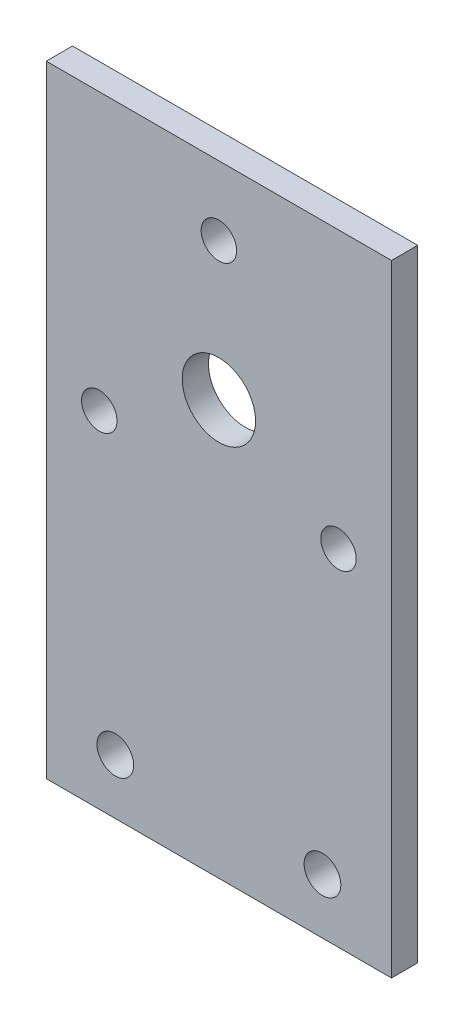
ISO-10303-21;
HEADER;
FILE_DESCRIPTION(('STEP AP214'),'2;1');
FILE_NAME('part.step','',(''),(''),'','','');
FILE_SCHEMA(('AUTOMOTIVE_DESIGN { 1 0 10303 214 1 1 1 1 }'));
ENDSEC;
DATA;
#1=APPLICATION_CONTEXT('core data for automotive mechanical design processes');
#2=APPLICATION_PROTOCOL_DEFINITION('international standard','automotive_design',2000,#1);
#3=PRODUCT_CONTEXT('',#1,'mechanical');
#4=PRODUCT('Part','Part','',(#3));
#5=PRODUCT_RELATED_PRODUCT_CATEGORY('part','',(#4));
#6=PRODUCT_DEFINITION_FORMATION('','',#4);
#7=PRODUCT_DEFINITION_CONTEXT('part definition',#1,'design');
#8=PRODUCT_DEFINITION('design','',#6,#7);
#9=PRODUCT_DEFINITION_SHAPE('','',#8);
#10=(LENGTH_UNIT() NAMED_UNIT(*) SI_UNIT(.MILLI.,.METRE.));
#11=(NAMED_UNIT(*) PLANE_ANGLE_UNIT() SI_UNIT($,.RADIAN.));
#12=(NAMED_UNIT(*) SI_UNIT($,.STERADIAN.) SOLID_ANGLE_UNIT());
#13=UNCERTAINTY_MEASURE_WITH_UNIT(LENGTH_MEASURE(1.E-05),#10,'distance_accuracy_value','');
#14=(GEOMETRIC_REPRESENTATION_CONTEXT(3) GLOBAL_UNCERTAINTY_ASSIGNED_CONTEXT((#13)) GLOBAL_UNIT_ASSIGNED_CONTEXT((#10,
#11,#12)) REPRESENTATION_CONTEXT('',''));
#15=CARTESIAN_POINT('',(0.,0.,0.));
#16=DIRECTION('',(0.,0.,1.));
#17=DIRECTION('',(1.,0.,0.));
#18=AXIS2_PLACEMENT_3D('',#15,#16,#17);
#19=CARTESIAN_POINT('',(0.,0.,-4.826));
#20=DIRECTION('',(-1.,0.,0.));
#21=DIRECTION('',(0.,0.,1.));
#22=AXIS2_PLACEMENT_3D('',#19,#20,#21);
#23=PLANE('',#22);
#24=DIRECTION('',(0.,-1.,0.));
#25=VECTOR('',#24,1.);
#26=CARTESIAN_POINT('',(0.,0.,0.));
#27=LINE('',#26,#25);
#28=CARTESIAN_POINT('',(0.,114.3,0.));
#29=VERTEX_POINT('',#28);
#30=CARTESIAN_POINT('',(0.,0.,0.));
#31=VERTEX_POINT('',#30);
#32=EDGE_CURVE('E106',#29,#31,#27,.T.);
#33=ORIENTED_EDGE('',*,*,#32,.F.);
#34=DIRECTION('',(0.,0.,1.));
#35=VECTOR('',#34,1.);
#36=CARTESIAN_POINT('',(0.,114.3,-4.826));
#37=LINE('',#36,#35);
#38=CARTESIAN_POINT('',(0.,114.3,-4.826));
#39=VERTEX_POINT('',#38);
#40=EDGE_CURVE('E11',#39,#29,#37,.T.);
#41=ORIENTED_EDGE('',*,*,#40,.F.);
#42=DIRECTION('',(0.,-1.,0.));
#43=VECTOR('',#42,1.);
#44=CARTESIAN_POINT('',(0.,0.,-4.826));
#45=LINE('',#44,#43);
#46=CARTESIAN_POINT('',(0.,0.,-4.826));
#47=VERTEX_POINT('',#46);
#48=EDGE_CURVE('E99',#39,#47,#45,.T.);
#49=ORIENTED_EDGE('',*,*,#48,.T.);
#50=DIRECTION('',(0.,0.,1.));
#51=VECTOR('',#50,1.);
#52=CARTESIAN_POINT('',(0.,0.,-4.826));
#53=LINE('',#52,#51);
#54=EDGE_CURVE('E44',#47,#31,#53,.T.);
#55=ORIENTED_EDGE('',*,*,#54,.T.);
#56=EDGE_LOOP('',(#33,#41,#49,#55));
#57=FACE_BOUND('',#56,.T.);
#58=ADVANCED_FACE('F41',(#57),#23,.T.);
#59=CARTESIAN_POINT('',(0.,114.3,-4.826));
#60=DIRECTION('',(0.,1.,0.));
#61=DIRECTION('',(0.,0.,1.));
#62=AXIS2_PLACEMENT_3D('',#59,#60,#61);
#63=PLANE('',#62);
#64=DIRECTION('',(-1.,0.,0.));
#65=VECTOR('',#64,1.);
#66=CARTESIAN_POINT('',(0.,114.3,0.));
#67=LINE('',#66,#65);
#68=CARTESIAN_POINT('',(63.5000000000001,114.3,0.));
#69=VERTEX_POINT('',#68);
#70=EDGE_CURVE('E101',#69,#29,#67,.T.);
#71=ORIENTED_EDGE('',*,*,#70,.F.);
#72=DIRECTION('',(0.,0.,1.));
#73=VECTOR('',#72,1.);
#74=CARTESIAN_POINT('',(63.5000000000001,114.3,-4.826));
#75=LINE('',#74,#73);
#76=CARTESIAN_POINT('',(63.5000000000001,114.3,-4.826));
#77=VERTEX_POINT('',#76);
#78=EDGE_CURVE('E50',#77,#69,#75,.T.);
#79=ORIENTED_EDGE('',*,*,#78,.F.);
#80=DIRECTION('',(-1.,0.,0.));
#81=VECTOR('',#80,1.);
#82=CARTESIAN_POINT('',(0.,114.3,-4.826));
#83=LINE('',#82,#81);
#84=EDGE_CURVE('E96',#77,#39,#83,.T.);
#85=ORIENTED_EDGE('',*,*,#84,.T.);
#86=ORIENTED_EDGE('',*,*,#40,.T.);
#87=EDGE_LOOP('',(#71,#79,#85,#86));
#88=FACE_BOUND('',#87,.T.);
#89=ADVANCED_FACE('F117',(#88),#63,.T.);
#90=CARTESIAN_POINT('',(63.5000000000002,0.,-4.826));
#91=DIRECTION('',(1.,0.,0.));
#92=DIRECTION('',(0.,0.,-1.));
#93=AXIS2_PLACEMENT_3D('',#90,#91,#92);
#94=PLANE('',#93);
#95=DIRECTION('',(0.,1.,0.));
#96=VECTOR('',#95,1.);
#97=CARTESIAN_POINT('',(63.5000000000002,0.,0.));
#98=LINE('',#97,#96);
#99=CARTESIAN_POINT('',(63.5000000000002,0.,0.));
#100=VERTEX_POINT('',#99);
#101=EDGE_CURVE('E91',#100,#69,#98,.T.);
#102=ORIENTED_EDGE('',*,*,#101,.F.);
#103=DIRECTION('',(0.,0.,1.));
#104=VECTOR('',#103,1.);
#105=CARTESIAN_POINT('',(63.5000000000002,0.,-4.826));
#106=LINE('',#105,#104);
#107=CARTESIAN_POINT('',(63.5000000000002,0.,-4.826));
#108=VERTEX_POINT('',#107);
#109=EDGE_CURVE('E86',#108,#100,#106,.T.);
#110=ORIENTED_EDGE('',*,*,#109,.F.);
#111=DIRECTION('',(0.,1.,0.));
#112=VECTOR('',#111,1.);
#113=CARTESIAN_POINT('',(63.5000000000002,0.,-4.826));
#114=LINE('',#113,#112);
#115=EDGE_CURVE('E89',#108,#77,#114,.T.);
#116=ORIENTED_EDGE('',*,*,#115,.T.);
#117=ORIENTED_EDGE('',*,*,#78,.T.);
#118=EDGE_LOOP('',(#102,#110,#116,#117));
#119=FACE_BOUND('',#118,.T.);
#120=ADVANCED_FACE('F88',(#119),#94,.T.);
#121=CARTESIAN_POINT('',(0.,0.,-4.826));
#122=DIRECTION('',(0.,-1.,0.));
#123=DIRECTION('',(0.,0.,-1.));
#124=AXIS2_PLACEMENT_3D('',#121,#122,#123);
#125=PLANE('',#124);
#126=DIRECTION('',(1.,0.,0.));
#127=VECTOR('',#126,1.);
#128=CARTESIAN_POINT('',(0.,0.,0.));
#129=LINE('',#128,#127);
#130=EDGE_CURVE('E109',#31,#100,#129,.T.);
#131=ORIENTED_EDGE('',*,*,#130,.F.);
#132=ORIENTED_EDGE('',*,*,#54,.F.);
#133=DIRECTION('',(1.,0.,0.));
#134=VECTOR('',#133,1.);
#135=CARTESIAN_POINT('',(0.,0.,-4.826));
#136=LINE('',#135,#134);
#137=EDGE_CURVE('E95',#47,#108,#136,.T.);
#138=ORIENTED_EDGE('',*,*,#137,.T.);
#139=ORIENTED_EDGE('',*,*,#109,.T.);
#140=EDGE_LOOP('',(#131,#132,#138,#139));
#141=FACE_BOUND('',#140,.T.);
#142=ADVANCED_FACE('F98',(#141),#125,.T.);
#143=CARTESIAN_POINT('',(0.,0.,-4.826));
#144=DIRECTION('',(0.,0.,-1.));
#145=DIRECTION('',(-1.,0.,0.));
#146=AXIS2_PLACEMENT_3D('',#143,#144,#145);
#147=PLANE('',#146);
#148=CARTESIAN_POINT('',(31.7500000000001,76.2000000000002,-4.826));
#149=DIRECTION('',(0.,0.,1.));
#150=DIRECTION('',(1.,0.,0.));
#151=AXIS2_PLACEMENT_3D('',#148,#149,#150);
#152=CIRCLE('',#151,6.746875);
#153=CARTESIAN_POINT('',(38.4968750000001,76.2000000000002,-4.826));
#154=VERTEX_POINT('',#153);
#155=EDGE_CURVE('E166',#154,#154,#152,.T.);
#156=ORIENTED_EDGE('',*,*,#155,.T.);
#157=EDGE_LOOP('',(#156));
#158=FACE_BOUND('',#157,.T.);
#159=CARTESIAN_POINT('',(31.7500000000001,101.6,-4.826));
#160=DIRECTION('',(0.,0.,1.));
#161=DIRECTION('',(1.,0.,0.));
#162=AXIS2_PLACEMENT_3D('',#159,#160,#161);
#163=CIRCLE('',#162,3.2639);
#164=CARTESIAN_POINT('',(35.0139000000001,101.6,-4.826));
#165=VERTEX_POINT('',#164);
#166=EDGE_CURVE('E176',#165,#165,#163,.T.);
#167=ORIENTED_EDGE('',*,*,#166,.T.);
#168=EDGE_LOOP('',(#167));
#169=FACE_BOUND('',#168,.T.);
#170=CARTESIAN_POINT('',(9.7536,63.5000000000002,-4.826));
#171=DIRECTION('',(0.,0.,1.));
#172=DIRECTION('',(1.,0.,0.));
#173=AXIS2_PLACEMENT_3D('',#170,#171,#172);
#174=CIRCLE('',#173,3.2639);
#175=CARTESIAN_POINT('',(13.0175,63.5000000000002,-4.826));
#176=VERTEX_POINT('',#175);
#177=EDGE_CURVE('E182',#176,#176,#174,.T.);
#178=ORIENTED_EDGE('',*,*,#177,.T.);
#179=EDGE_LOOP('',(#178));
#180=FACE_BOUND('',#179,.T.);
#181=CARTESIAN_POINT('',(53.7464000000002,63.5000000000002,-4.826));
#182=DIRECTION('',(0.,0.,1.));
#183=DIRECTION('',(1.,0.,0.));
#184=AXIS2_PLACEMENT_3D('',#181,#182,#183);
#185=CIRCLE('',#184,3.2639);
#186=CARTESIAN_POINT('',(57.0103000000002,63.5000000000002,-4.826));
#187=VERTEX_POINT('',#186);
#188=EDGE_CURVE('E188',#187,#187,#185,.T.);
#189=ORIENTED_EDGE('',*,*,#188,.T.);
#190=EDGE_LOOP('',(#189));
#191=FACE_BOUND('',#190,.T.);
#192=CARTESIAN_POINT('',(12.7000000000001,10.16,-4.826));
#193=DIRECTION('',(0.,0.,1.));
#194=DIRECTION('',(1.,0.,0.));
#195=AXIS2_PLACEMENT_3D('',#192,#193,#194);
#196=CIRCLE('',#195,3.3782);
#197=CARTESIAN_POINT('',(16.0782000000001,10.16,-4.826));
#198=VERTEX_POINT('',#197);
#199=EDGE_CURVE('E194',#198,#198,#196,.T.);
#200=ORIENTED_EDGE('',*,*,#199,.T.);
#201=EDGE_LOOP('',(#200));
#202=FACE_BOUND('',#201,.T.);
#203=CARTESIAN_POINT('',(50.8000000000002,10.16,-4.826));
#204=DIRECTION('',(0.,0.,1.));
#205=DIRECTION('',(1.,0.,0.));
#206=AXIS2_PLACEMENT_3D('',#203,#204,#205);
#207=CIRCLE('',#206,3.3782);
#208=CARTESIAN_POINT('',(54.1782000000002,10.16,-4.826));
#209=VERTEX_POINT('',#208);
#210=EDGE_CURVE('E110',#209,#209,#207,.T.);
#211=ORIENTED_EDGE('',*,*,#210,.T.);
#212=EDGE_LOOP('',(#211));
#213=FACE_BOUND('',#212,.T.);
#214=ORIENTED_EDGE('',*,*,#48,.F.);
#215=ORIENTED_EDGE('',*,*,#84,.F.);
#216=ORIENTED_EDGE('',*,*,#115,.F.);
#217=ORIENTED_EDGE('',*,*,#137,.F.);
#218=EDGE_LOOP('',(#214,#215,#216,#217));
#219=FACE_BOUND('',#218,.T.);
#220=ADVANCED_FACE('F94',(#158,#169,#180,#191,#202,#213,#219),#147,.T.);
#221=CARTESIAN_POINT('',(0.,0.,0.));
#222=DIRECTION('',(0.,0.,-1.));
#223=DIRECTION('',(-1.,0.,0.));
#224=AXIS2_PLACEMENT_3D('',#221,#222,#223);
#225=PLANE('',#224);
#226=CARTESIAN_POINT('',(31.7500000000001,76.2000000000002,0.));
#227=DIRECTION('',(0.,0.,1.));
#228=DIRECTION('',(1.,0.,0.));
#229=AXIS2_PLACEMENT_3D('',#226,#227,#228);
#230=CIRCLE('',#229,6.746875);
#231=CARTESIAN_POINT('',(38.4968750000001,76.2000000000002,0.));
#232=VERTEX_POINT('',#231);
#233=EDGE_CURVE('E169',#232,#232,#230,.T.);
#234=ORIENTED_EDGE('',*,*,#233,.F.);
#235=EDGE_LOOP('',(#234));
#236=FACE_BOUND('',#235,.T.);
#237=CARTESIAN_POINT('',(31.7500000000001,101.6,0.));
#238=DIRECTION('',(0.,0.,1.));
#239=DIRECTION('',(1.,0.,0.));
#240=AXIS2_PLACEMENT_3D('',#237,#238,#239);
#241=CIRCLE('',#240,3.26389999999999);
#242=CARTESIAN_POINT('',(35.0139000000001,101.6,0.));
#243=VERTEX_POINT('',#242);
#244=EDGE_CURVE('E171',#243,#243,#241,.T.);
#245=ORIENTED_EDGE('',*,*,#244,.F.);
#246=EDGE_LOOP('',(#245));
#247=FACE_BOUND('',#246,.T.);
#248=CARTESIAN_POINT('',(9.7536,63.5000000000002,0.));
#249=DIRECTION('',(0.,0.,1.));
#250=DIRECTION('',(1.,0.,0.));
#251=AXIS2_PLACEMENT_3D('',#248,#249,#250);
#252=CIRCLE('',#251,3.26389999999999);
#253=CARTESIAN_POINT('',(13.0175,63.5000000000002,0.));
#254=VERTEX_POINT('',#253);
#255=EDGE_CURVE('E179',#254,#254,#252,.T.);
#256=ORIENTED_EDGE('',*,*,#255,.F.);
#257=EDGE_LOOP('',(#256));
#258=FACE_BOUND('',#257,.T.);
#259=CARTESIAN_POINT('',(53.7464000000002,63.5000000000002,0.));
#260=DIRECTION('',(0.,0.,1.));
#261=DIRECTION('',(1.,0.,0.));
#262=AXIS2_PLACEMENT_3D('',#259,#260,#261);
#263=CIRCLE('',#262,3.26389999999999);
#264=CARTESIAN_POINT('',(57.0103000000002,63.5000000000002,0.));
#265=VERTEX_POINT('',#264);
#266=EDGE_CURVE('E185',#265,#265,#263,.T.);
#267=ORIENTED_EDGE('',*,*,#266,.F.);
#268=EDGE_LOOP('',(#267));
#269=FACE_BOUND('',#268,.T.);
#270=CARTESIAN_POINT('',(12.7000000000001,10.16,0.));
#271=DIRECTION('',(0.,0.,1.));
#272=DIRECTION('',(1.,0.,0.));
#273=AXIS2_PLACEMENT_3D('',#270,#271,#272);
#274=CIRCLE('',#273,3.3782);
#275=CARTESIAN_POINT('',(16.0782000000001,10.16,0.));
#276=VERTEX_POINT('',#275);
#277=EDGE_CURVE('E191',#276,#276,#274,.T.);
#278=ORIENTED_EDGE('',*,*,#277,.F.);
#279=EDGE_LOOP('',(#278));
#280=FACE_BOUND('',#279,.T.);
#281=CARTESIAN_POINT('',(50.8000000000002,10.16,0.));
#282=DIRECTION('',(0.,0.,1.));
#283=DIRECTION('',(1.,0.,0.));
#284=AXIS2_PLACEMENT_3D('',#281,#282,#283);
#285=CIRCLE('',#284,3.3782);
#286=CARTESIAN_POINT('',(54.1782000000002,10.16,0.));
#287=VERTEX_POINT('',#286);
#288=EDGE_CURVE('E197',#287,#287,#285,.T.);
#289=ORIENTED_EDGE('',*,*,#288,.F.);
#290=EDGE_LOOP('',(#289));
#291=FACE_BOUND('',#290,.T.);
#292=ORIENTED_EDGE('',*,*,#32,.T.);
#293=ORIENTED_EDGE('',*,*,#130,.T.);
#294=ORIENTED_EDGE('',*,*,#101,.T.);
#295=ORIENTED_EDGE('',*,*,#70,.T.);
#296=EDGE_LOOP('',(#292,#293,#294,#295));
#297=FACE_BOUND('',#296,.T.);
#298=ADVANCED_FACE('F116',(#236,#247,#258,#269,#280,#291,#297),#225,.F.);
#299=CARTESIAN_POINT('',(50.8000000000002,10.16,0.));
#300=DIRECTION('',(0.,0.,1.));
#301=DIRECTION('',(1.,0.,0.));
#302=AXIS2_PLACEMENT_3D('',#299,#300,#301);
#303=CYLINDRICAL_SURFACE('',#302,3.3782);
#304=ORIENTED_EDGE('',*,*,#210,.F.);
#305=EDGE_LOOP('',(#304));
#306=FACE_BOUND('',#305,.T.);
#307=ORIENTED_EDGE('',*,*,#288,.T.);
#308=EDGE_LOOP('',(#307));
#309=FACE_BOUND('',#308,.T.);
#310=ADVANCED_FACE('F135',(#306,#309),#303,.F.);
#311=CARTESIAN_POINT('',(12.7000000000001,10.16,0.));
#312=DIRECTION('',(0.,0.,1.));
#313=DIRECTION('',(1.,0.,0.));
#314=AXIS2_PLACEMENT_3D('',#311,#312,#313);
#315=CYLINDRICAL_SURFACE('',#314,3.3782);
#316=ORIENTED_EDGE('',*,*,#199,.F.);
#317=EDGE_LOOP('',(#316));
#318=FACE_BOUND('',#317,.T.);
#319=ORIENTED_EDGE('',*,*,#277,.T.);
#320=EDGE_LOOP('',(#319));
#321=FACE_BOUND('',#320,.T.);
#322=ADVANCED_FACE('F142',(#318,#321),#315,.F.);
#323=CARTESIAN_POINT('',(53.7464000000002,63.5000000000002,0.));
#324=DIRECTION('',(0.,0.,1.));
#325=DIRECTION('',(1.,0.,0.));
#326=AXIS2_PLACEMENT_3D('',#323,#324,#325);
#327=CYLINDRICAL_SURFACE('',#326,3.26389999999999);
#328=ORIENTED_EDGE('',*,*,#188,.F.);
#329=EDGE_LOOP('',(#328));
#330=FACE_BOUND('',#329,.T.);
#331=ORIENTED_EDGE('',*,*,#266,.T.);
#332=EDGE_LOOP('',(#331));
#333=FACE_BOUND('',#332,.T.);
#334=ADVANCED_FACE('F146',(#330,#333),#327,.F.);
#335=CARTESIAN_POINT('',(9.7536,63.5000000000002,0.));
#336=DIRECTION('',(0.,0.,1.));
#337=DIRECTION('',(1.,0.,0.));
#338=AXIS2_PLACEMENT_3D('',#335,#336,#337);
#339=CYLINDRICAL_SURFACE('',#338,3.26389999999999);
#340=ORIENTED_EDGE('',*,*,#177,.F.);
#341=EDGE_LOOP('',(#340));
#342=FACE_BOUND('',#341,.T.);
#343=ORIENTED_EDGE('',*,*,#255,.T.);
#344=EDGE_LOOP('',(#343));
#345=FACE_BOUND('',#344,.T.);
#346=ADVANCED_FACE('F150',(#342,#345),#339,.F.);
#347=CARTESIAN_POINT('',(31.7500000000001,101.6,0.));
#348=DIRECTION('',(0.,0.,1.));
#349=DIRECTION('',(1.,0.,0.));
#350=AXIS2_PLACEMENT_3D('',#347,#348,#349);
#351=CYLINDRICAL_SURFACE('',#350,3.26389999999999);
#352=ORIENTED_EDGE('',*,*,#166,.F.);
#353=EDGE_LOOP('',(#352));
#354=FACE_BOUND('',#353,.T.);
#355=ORIENTED_EDGE('',*,*,#244,.T.);
#356=EDGE_LOOP('',(#355));
#357=FACE_BOUND('',#356,.T.);
#358=ADVANCED_FACE('F154',(#354,#357),#351,.F.);
#359=CARTESIAN_POINT('',(31.7500000000001,76.2000000000002,0.));
#360=DIRECTION('',(0.,0.,1.));
#361=DIRECTION('',(1.,0.,0.));
#362=AXIS2_PLACEMENT_3D('',#359,#360,#361);
#363=CYLINDRICAL_SURFACE('',#362,6.746875);
#364=ORIENTED_EDGE('',*,*,#155,.F.);
#365=EDGE_LOOP('',(#364));
#366=FACE_BOUND('',#365,.T.);
#367=ORIENTED_EDGE('',*,*,#233,.T.);
#368=EDGE_LOOP('',(#367));
#369=FACE_BOUND('',#368,.T.);
#370=ADVANCED_FACE('F158',(#366,#369),#363,.F.);
#371=CLOSED_SHELL('',(#58,#89,#120,#142,#220,#298,#310,#322,#334,#346,#358,#370));
#372=MANIFOLD_SOLID_BREP('B2',#371);
#373=ADVANCED_BREP_SHAPE_REPRESENTATION('',(#18,#372),#14);
#374=SHAPE_DEFINITION_REPRESENTATION(#9,#373);
ENDSEC;
END-ISO-10303-21;
